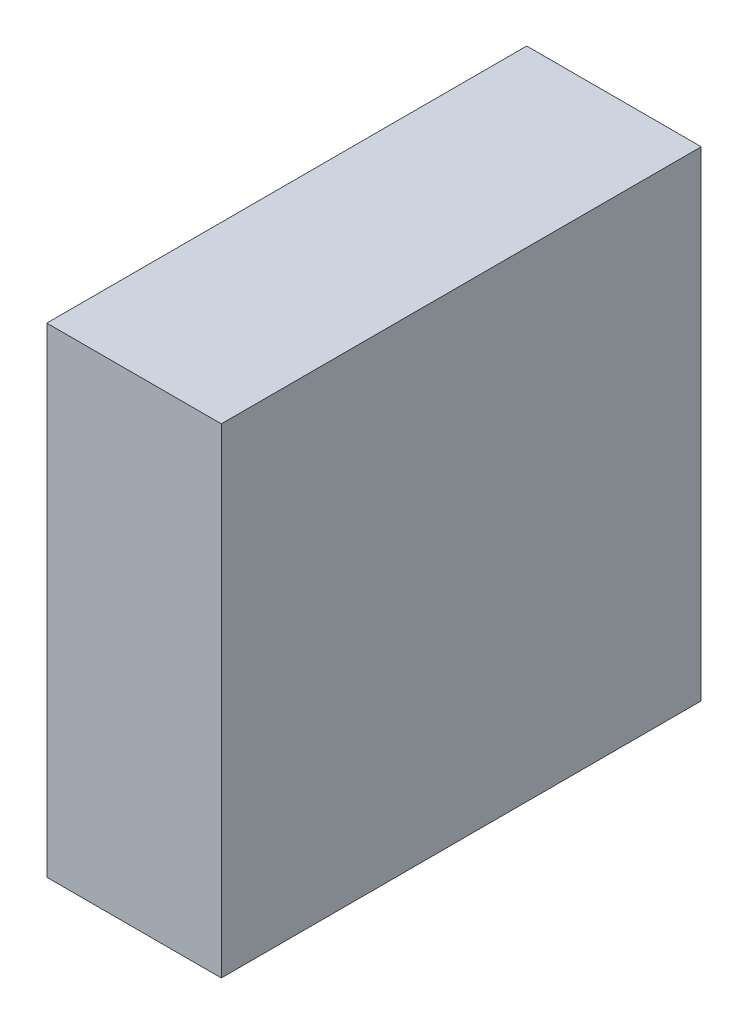
ISO-10303-21;
HEADER;
FILE_DESCRIPTION(('STEP AP214'),'2;1');
FILE_NAME('part.step','',(''),(''),'','','');
FILE_SCHEMA(('AUTOMOTIVE_DESIGN { 1 0 10303 214 1 1 1 1 }'));
ENDSEC;
DATA;
#1=APPLICATION_CONTEXT('core data for automotive mechanical design processes');
#2=APPLICATION_PROTOCOL_DEFINITION('international standard','automotive_design',2000,#1);
#3=PRODUCT_CONTEXT('',#1,'mechanical');
#4=PRODUCT('Part','Part','',(#3));
#5=PRODUCT_RELATED_PRODUCT_CATEGORY('part','',(#4));
#6=PRODUCT_DEFINITION_FORMATION('','',#4);
#7=PRODUCT_DEFINITION_CONTEXT('part definition',#1,'design');
#8=PRODUCT_DEFINITION('design','',#6,#7);
#9=PRODUCT_DEFINITION_SHAPE('','',#8);
#10=(LENGTH_UNIT() NAMED_UNIT(*) SI_UNIT(.MILLI.,.METRE.));
#11=(NAMED_UNIT(*) PLANE_ANGLE_UNIT() SI_UNIT($,.RADIAN.));
#12=(NAMED_UNIT(*) SI_UNIT($,.STERADIAN.) SOLID_ANGLE_UNIT());
#13=UNCERTAINTY_MEASURE_WITH_UNIT(LENGTH_MEASURE(1.E-05),#10,'distance_accuracy_value','');
#14=(GEOMETRIC_REPRESENTATION_CONTEXT(3) GLOBAL_UNCERTAINTY_ASSIGNED_CONTEXT((#13)) GLOBAL_UNIT_ASSIGNED_CONTEXT((#10,
#11,#12)) REPRESENTATION_CONTEXT('',''));
#15=CARTESIAN_POINT('',(0.,0.,0.));
#16=DIRECTION('',(0.,0.,1.));
#17=DIRECTION('',(1.,0.,0.));
#18=AXIS2_PLACEMENT_3D('',#15,#16,#17);
#19=CARTESIAN_POINT('',(40.,53.2000095220461,-56.0822473431621));
#20=DIRECTION('',(0.,0.,1.));
#21=DIRECTION('',(0.,-1.,0.));
#22=AXIS2_PLACEMENT_3D('',#19,#20,#21);
#23=PLANE('',#22);
#24=DIRECTION('',(0.,1.,0.));
#25=VECTOR('',#24,1.);
#26=CARTESIAN_POINT('',(0.,53.2000095220461,-56.0822473431621));
#27=LINE('',#26,#25);
#28=CARTESIAN_POINT('',(0.,-56.7999904779539,-56.0822473431621));
#29=VERTEX_POINT('',#28);
#30=CARTESIAN_POINT('',(0.,53.2000095220461,-56.0822473431621));
#31=VERTEX_POINT('',#30);
#32=EDGE_CURVE('E98',#29,#31,#27,.T.);
#33=ORIENTED_EDGE('',*,*,#32,.T.);
#34=DIRECTION('',(-1.,0.,0.));
#35=VECTOR('',#34,1.);
#36=CARTESIAN_POINT('',(40.,53.2000095220461,-56.0822473431621));
#37=LINE('',#36,#35);
#38=CARTESIAN_POINT('',(40.,53.2000095220461,-56.0822473431621));
#39=VERTEX_POINT('',#38);
#40=EDGE_CURVE('E11',#39,#31,#37,.T.);
#41=ORIENTED_EDGE('',*,*,#40,.F.);
#42=DIRECTION('',(0.,1.,0.));
#43=VECTOR('',#42,1.);
#44=CARTESIAN_POINT('',(40.,53.2000095220461,-56.0822473431621));
#45=LINE('',#44,#43);
#46=CARTESIAN_POINT('',(40.,-56.7999904779539,-56.0822473431621));
#47=VERTEX_POINT('',#46);
#48=EDGE_CURVE('E86',#47,#39,#45,.T.);
#49=ORIENTED_EDGE('',*,*,#48,.F.);
#50=DIRECTION('',(-1.,0.,0.));
#51=VECTOR('',#50,1.);
#52=CARTESIAN_POINT('',(40.,-56.7999904779539,-56.0822473431621));
#53=LINE('',#52,#51);
#54=EDGE_CURVE('E94',#47,#29,#53,.T.);
#55=ORIENTED_EDGE('',*,*,#54,.T.);
#56=EDGE_LOOP('',(#33,#41,#49,#55));
#57=FACE_BOUND('',#56,.T.);
#58=ADVANCED_FACE('F35',(#57),#23,.F.);
#59=CARTESIAN_POINT('',(40.,53.2000095220461,-56.0822473431621));
#60=DIRECTION('',(0.,-1.,0.));
#61=DIRECTION('',(0.,0.,-1.));
#62=AXIS2_PLACEMENT_3D('',#59,#60,#61);
#63=PLANE('',#62);
#64=DIRECTION('',(0.,0.,1.));
#65=VECTOR('',#64,1.);
#66=CARTESIAN_POINT('',(0.,53.2000095220461,-56.0822473431621));
#67=LINE('',#66,#65);
#68=CARTESIAN_POINT('',(0.,53.200009522046,53.9177526568379));
#69=VERTEX_POINT('',#68);
#70=EDGE_CURVE('E90',#31,#69,#67,.T.);
#71=ORIENTED_EDGE('',*,*,#70,.T.);
#72=DIRECTION('',(-1.,0.,0.));
#73=VECTOR('',#72,1.);
#74=CARTESIAN_POINT('',(40.,53.200009522046,53.9177526568379));
#75=LINE('',#74,#73);
#76=CARTESIAN_POINT('',(40.,53.200009522046,53.9177526568379));
#77=VERTEX_POINT('',#76);
#78=EDGE_CURVE('E43',#77,#69,#75,.T.);
#79=ORIENTED_EDGE('',*,*,#78,.F.);
#80=DIRECTION('',(0.,0.,1.));
#81=VECTOR('',#80,1.);
#82=CARTESIAN_POINT('',(40.,53.2000095220461,-56.0822473431621));
#83=LINE('',#82,#81);
#84=EDGE_CURVE('E81',#39,#77,#83,.T.);
#85=ORIENTED_EDGE('',*,*,#84,.F.);
#86=ORIENTED_EDGE('',*,*,#40,.T.);
#87=EDGE_LOOP('',(#71,#79,#85,#86));
#88=FACE_BOUND('',#87,.T.);
#89=ADVANCED_FACE('F89',(#88),#63,.F.);
#90=CARTESIAN_POINT('',(40.,53.200009522046,53.9177526568379));
#91=DIRECTION('',(0.,0.,-1.));
#92=DIRECTION('',(0.,1.,0.));
#93=AXIS2_PLACEMENT_3D('',#90,#91,#92);
#94=PLANE('',#93);
#95=DIRECTION('',(0.,-1.,0.));
#96=VECTOR('',#95,1.);
#97=CARTESIAN_POINT('',(0.,53.200009522046,53.9177526568379));
#98=LINE('',#97,#96);
#99=CARTESIAN_POINT('',(0.,-56.7999904779539,53.9177526568379));
#100=VERTEX_POINT('',#99);
#101=EDGE_CURVE('E68',#69,#100,#98,.T.);
#102=ORIENTED_EDGE('',*,*,#101,.T.);
#103=DIRECTION('',(-1.,0.,0.));
#104=VECTOR('',#103,1.);
#105=CARTESIAN_POINT('',(40.,-56.7999904779539,53.9177526568379));
#106=LINE('',#105,#104);
#107=CARTESIAN_POINT('',(40.,-56.7999904779539,53.9177526568379));
#108=VERTEX_POINT('',#107);
#109=EDGE_CURVE('E91',#108,#100,#106,.T.);
#110=ORIENTED_EDGE('',*,*,#109,.F.);
#111=DIRECTION('',(0.,-1.,0.));
#112=VECTOR('',#111,1.);
#113=CARTESIAN_POINT('',(40.,53.200009522046,53.9177526568379));
#114=LINE('',#113,#112);
#115=EDGE_CURVE('E84',#77,#108,#114,.T.);
#116=ORIENTED_EDGE('',*,*,#115,.F.);
#117=ORIENTED_EDGE('',*,*,#78,.T.);
#118=EDGE_LOOP('',(#102,#110,#116,#117));
#119=FACE_BOUND('',#118,.T.);
#120=ADVANCED_FACE('F92',(#119),#94,.F.);
#121=CARTESIAN_POINT('',(40.,-56.7999904779539,-56.0822473431621));
#122=DIRECTION('',(0.,1.,0.));
#123=DIRECTION('',(0.,0.,1.));
#124=AXIS2_PLACEMENT_3D('',#121,#122,#123);
#125=PLANE('',#124);
#126=DIRECTION('',(0.,0.,-1.));
#127=VECTOR('',#126,1.);
#128=CARTESIAN_POINT('',(0.,-56.7999904779539,-56.0822473431621));
#129=LINE('',#128,#127);
#130=EDGE_CURVE('E74',#100,#29,#129,.T.);
#131=ORIENTED_EDGE('',*,*,#130,.T.);
#132=ORIENTED_EDGE('',*,*,#54,.F.);
#133=DIRECTION('',(0.,0.,-1.));
#134=VECTOR('',#133,1.);
#135=CARTESIAN_POINT('',(40.,-56.7999904779539,-56.0822473431621));
#136=LINE('',#135,#134);
#137=EDGE_CURVE('E51',#108,#47,#136,.T.);
#138=ORIENTED_EDGE('',*,*,#137,.F.);
#139=ORIENTED_EDGE('',*,*,#109,.T.);
#140=EDGE_LOOP('',(#131,#132,#138,#139));
#141=FACE_BOUND('',#140,.T.);
#142=ADVANCED_FACE('F105',(#141),#125,.F.);
#143=CARTESIAN_POINT('',(40.,0.,0.));
#144=DIRECTION('',(-1.,0.,0.));
#145=DIRECTION('',(0.,0.,1.));
#146=AXIS2_PLACEMENT_3D('',#143,#144,#145);
#147=PLANE('',#146);
#148=ORIENTED_EDGE('',*,*,#48,.T.);
#149=ORIENTED_EDGE('',*,*,#84,.T.);
#150=ORIENTED_EDGE('',*,*,#115,.T.);
#151=ORIENTED_EDGE('',*,*,#137,.T.);
#152=EDGE_LOOP('',(#148,#149,#150,#151));
#153=FACE_BOUND('',#152,.T.);
#154=ADVANCED_FACE('F82',(#153),#147,.F.);
#155=CARTESIAN_POINT('',(0.,0.,0.));
#156=DIRECTION('',(-1.,0.,0.));
#157=DIRECTION('',(0.,0.,1.));
#158=AXIS2_PLACEMENT_3D('',#155,#156,#157);
#159=PLANE('',#158);
#160=ORIENTED_EDGE('',*,*,#32,.F.);
#161=ORIENTED_EDGE('',*,*,#130,.F.);
#162=ORIENTED_EDGE('',*,*,#101,.F.);
#163=ORIENTED_EDGE('',*,*,#70,.F.);
#164=EDGE_LOOP('',(#160,#161,#162,#163));
#165=FACE_BOUND('',#164,.T.);
#166=ADVANCED_FACE('F108',(#165),#159,.T.);
#167=CLOSED_SHELL('',(#58,#89,#120,#142,#154,#166));
#168=MANIFOLD_SOLID_BREP('B2',#167);
#169=ADVANCED_BREP_SHAPE_REPRESENTATION('',(#18,#168),#14);
#170=SHAPE_DEFINITION_REPRESENTATION(#9,#169);
ENDSEC;
END-ISO-10303-21;
